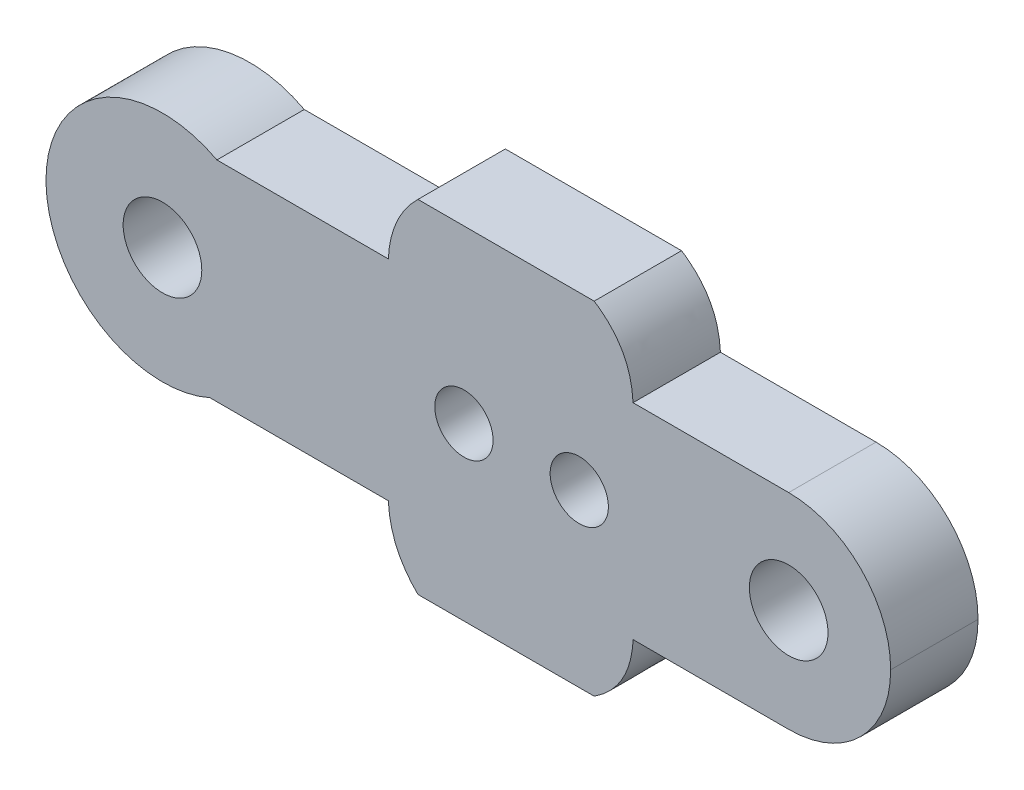
ISO-10303-21;
HEADER;
FILE_DESCRIPTION(('STEP AP214'),'2;1');
FILE_NAME('part.step','',(''),(''),'','','');
FILE_SCHEMA(('AUTOMOTIVE_DESIGN { 1 0 10303 214 1 1 1 1 }'));
ENDSEC;
DATA;
#1=APPLICATION_CONTEXT('core data for automotive mechanical design processes');
#2=APPLICATION_PROTOCOL_DEFINITION('international standard','automotive_design',2000,#1);
#3=PRODUCT_CONTEXT('',#1,'mechanical');
#4=PRODUCT('Part','Part','',(#3));
#5=PRODUCT_RELATED_PRODUCT_CATEGORY('part','',(#4));
#6=PRODUCT_DEFINITION_FORMATION('','',#4);
#7=PRODUCT_DEFINITION_CONTEXT('part definition',#1,'design');
#8=PRODUCT_DEFINITION('design','',#6,#7);
#9=PRODUCT_DEFINITION_SHAPE('','',#8);
#10=(LENGTH_UNIT() NAMED_UNIT(*) SI_UNIT(.MILLI.,.METRE.));
#11=(NAMED_UNIT(*) PLANE_ANGLE_UNIT() SI_UNIT($,.RADIAN.));
#12=(NAMED_UNIT(*) SI_UNIT($,.STERADIAN.) SOLID_ANGLE_UNIT());
#13=UNCERTAINTY_MEASURE_WITH_UNIT(LENGTH_MEASURE(1.E-05),#10,'distance_accuracy_value','');
#14=(GEOMETRIC_REPRESENTATION_CONTEXT(3) GLOBAL_UNCERTAINTY_ASSIGNED_CONTEXT((#13)) GLOBAL_UNIT_ASSIGNED_CONTEXT((#10,
#11,#12)) REPRESENTATION_CONTEXT('',''));
#15=CARTESIAN_POINT('',(0.,0.,0.));
#16=DIRECTION('',(0.,0.,1.));
#17=DIRECTION('',(1.,0.,0.));
#18=AXIS2_PLACEMENT_3D('',#15,#16,#17);
#19=CARTESIAN_POINT('',(21.4999681225819,-0.0214101903655824,3.));
#20=DIRECTION('',(0.,0.,-1.));
#21=DIRECTION('',(-1.,0.,0.));
#22=AXIS2_PLACEMENT_3D('',#19,#20,#21);
#23=PLANE('',#22);
#24=CARTESIAN_POINT('',(21.4999681225819,-0.0214101903655824,3.));
#25=DIRECTION('',(0.,0.,1.));
#26=DIRECTION('',(-1.,0.,0.));
#27=AXIS2_PLACEMENT_3D('',#24,#25,#26);
#28=CIRCLE('',#27,3.50000000000029);
#29=CARTESIAN_POINT('',(21.4999681225822,-3.52141019036587,3.));
#30=VERTEX_POINT('',#29);
#31=CARTESIAN_POINT('',(24.9999026367908,-1.06424607624819E-12,3.));
#32=VERTEX_POINT('',#31);
#33=EDGE_CURVE('E231',#30,#32,#28,.T.);
#34=ORIENTED_EDGE('',*,*,#33,.T.);
#35=CARTESIAN_POINT('',(21.4999681225822,0.0214101903658728,3.));
#36=DIRECTION('',(0.,0.,1.));
#37=DIRECTION('',(1.,0.,0.));
#38=AXIS2_PLACEMENT_3D('',#35,#36,#37);
#39=CIRCLE('',#38,3.5);
#40=CARTESIAN_POINT('',(21.4999681225822,3.52141019036587,3.));
#41=VERTEX_POINT('',#40);
#42=EDGE_CURVE('E109',#32,#41,#39,.T.);
#43=ORIENTED_EDGE('',*,*,#42,.T.);
#44=DIRECTION('',(-1.,0.,0.));
#45=VECTOR('',#44,1.);
#46=CARTESIAN_POINT('',(21.4999681225822,3.52141019036587,3.));
#47=LINE('',#46,#45);
#48=CARTESIAN_POINT('',(16.1562785524943,3.52141019036587,3.));
#49=VERTEX_POINT('',#48);
#50=EDGE_CURVE('E225',#41,#49,#47,.T.);
#51=ORIENTED_EDGE('',*,*,#50,.T.);
#52=CARTESIAN_POINT('',(16.1562785524943,3.52141019036587,3.));
#53=CARTESIAN_POINT('',(16.0881603388808,5.05153717266608,3.));
#54=CARTESIAN_POINT('',(14.8219003344393,5.87390950454192,3.));
#55=B_SPLINE_CURVE_WITH_KNOTS('',2,(#52,#53,#54),.UNSPECIFIED.,.F.,.F.,(3,3),(0.,1.),.UNSPECIFIED.);
#56=CARTESIAN_POINT('',(14.8219003344393,5.87390950454192,3.));
#57=VERTEX_POINT('',#56);
#58=EDGE_CURVE('E220',#49,#57,#55,.T.);
#59=ORIENTED_EDGE('',*,*,#58,.T.);
#60=DIRECTION('',(-1.,0.,0.));
#61=VECTOR('',#60,1.);
#62=CARTESIAN_POINT('',(8.77128221695817,5.87390950454192,3.));
#63=LINE('',#62,#61);
#64=CARTESIAN_POINT('',(8.77128221695817,5.87390950454192,3.));
#65=VERTEX_POINT('',#64);
#66=EDGE_CURVE('E199',#57,#65,#63,.T.);
#67=ORIENTED_EDGE('',*,*,#66,.T.);
#68=CARTESIAN_POINT('',(8.77128221695817,5.87390950454192,3.));
#69=CARTESIAN_POINT('',(7.81640396631,4.94468910288925,3.));
#70=CARTESIAN_POINT('',(7.75477837322135,3.59527965532397,3.));
#71=B_SPLINE_CURVE_WITH_KNOTS('',2,(#68,#69,#70),.UNSPECIFIED.,.F.,.F.,(3,3),(0.,1.),.UNSPECIFIED.);
#72=CARTESIAN_POINT('',(7.75477837322135,3.59527965532397,3.));
#73=VERTEX_POINT('',#72);
#74=EDGE_CURVE('E194',#65,#73,#71,.T.);
#75=ORIENTED_EDGE('',*,*,#74,.T.);
#76=DIRECTION('',(-1.,0.,0.));
#77=VECTOR('',#76,1.);
#78=CARTESIAN_POINT('',(1.86834673217975,3.59527965532397,3.));
#79=LINE('',#78,#77);
#80=CARTESIAN_POINT('',(1.86834673217975,3.59527965532397,3.));
#81=VERTEX_POINT('',#80);
#82=EDGE_CURVE('E192',#73,#81,#79,.T.);
#83=ORIENTED_EDGE('',*,*,#82,.T.);
#84=CARTESIAN_POINT('',(0.,0.0584335336566329,3.));
#85=DIRECTION('',(0.,0.,1.));
#86=DIRECTION('',(1.,0.,0.));
#87=AXIS2_PLACEMENT_3D('',#84,#85,#86);
#88=CIRCLE('',#87,4.);
#89=CARTESIAN_POINT('',(1.62799875081931,-3.59527965532397,3.));
#90=VERTEX_POINT('',#89);
#91=EDGE_CURVE('E190',#81,#90,#88,.T.);
#92=ORIENTED_EDGE('',*,*,#91,.T.);
#93=DIRECTION('',(1.,0.,0.));
#94=VECTOR('',#93,1.);
#95=CARTESIAN_POINT('',(1.62799875081931,-3.59527965532397,3.));
#96=LINE('',#95,#94);
#97=CARTESIAN_POINT('',(7.75477837322134,-3.59527965532397,3.));
#98=VERTEX_POINT('',#97);
#99=EDGE_CURVE('E185',#90,#98,#96,.T.);
#100=ORIENTED_EDGE('',*,*,#99,.T.);
#101=CARTESIAN_POINT('',(7.75477837322134,-3.59527965532397,3.));
#102=CARTESIAN_POINT('',(7.81640396631,-4.94468910288925,3.));
#103=CARTESIAN_POINT('',(8.77128221695817,-5.87390950454192,3.));
#104=B_SPLINE_CURVE_WITH_KNOTS('',2,(#101,#102,#103),.UNSPECIFIED.,.F.,.F.,(3,3),(0.,1.),.UNSPECIFIED.);
#105=CARTESIAN_POINT('',(8.77128221695817,-5.87390950454192,3.));
#106=VERTEX_POINT('',#105);
#107=EDGE_CURVE('E143',#98,#106,#104,.T.);
#108=ORIENTED_EDGE('',*,*,#107,.T.);
#109=DIRECTION('',(1.,0.,0.));
#110=VECTOR('',#109,1.);
#111=CARTESIAN_POINT('',(8.77128221695817,-5.87390950454192,3.));
#112=LINE('',#111,#110);
#113=CARTESIAN_POINT('',(14.8219003344393,-5.87390950454192,3.));
#114=VERTEX_POINT('',#113);
#115=EDGE_CURVE('E137',#106,#114,#112,.T.);
#116=ORIENTED_EDGE('',*,*,#115,.T.);
#117=CARTESIAN_POINT('',(14.8219003344393,-5.87390950454192,3.));
#118=CARTESIAN_POINT('',(16.0881603388808,-5.05153717266608,3.));
#119=CARTESIAN_POINT('',(16.1562785524943,-3.52141019036587,3.));
#120=B_SPLINE_CURVE_WITH_KNOTS('',2,(#117,#118,#119),.UNSPECIFIED.,.F.,.F.,(3,3),(0.,1.),.UNSPECIFIED.);
#121=CARTESIAN_POINT('',(16.1562785524943,-3.52141019036587,3.));
#122=VERTEX_POINT('',#121);
#123=EDGE_CURVE('E141',#114,#122,#120,.T.);
#124=ORIENTED_EDGE('',*,*,#123,.T.);
#125=DIRECTION('',(1.,0.,0.));
#126=VECTOR('',#125,1.);
#127=CARTESIAN_POINT('',(21.4999681225822,-3.52141019036587,3.));
#128=LINE('',#127,#126);
#129=EDGE_CURVE('E51',#122,#30,#128,.T.);
#130=ORIENTED_EDGE('',*,*,#129,.T.);
#131=EDGE_LOOP('',(#34,#43,#51,#59,#67,#75,#83,#92,#100,#108,#116,#124,#130));
#132=FACE_BOUND('',#131,.T.);
#133=CARTESIAN_POINT('',(0.,0.0584335336566329,3.));
#134=DIRECTION('',(0.,0.,1.));
#135=DIRECTION('',(1.,0.,0.));
#136=AXIS2_PLACEMENT_3D('',#133,#134,#135);
#137=CIRCLE('',#136,1.35);
#138=CARTESIAN_POINT('',(1.35,0.0584335336566329,3.));
#139=VERTEX_POINT('',#138);
#140=EDGE_CURVE('E236',#139,#139,#137,.T.);
#141=ORIENTED_EDGE('',*,*,#140,.F.);
#142=EDGE_LOOP('',(#141));
#143=FACE_BOUND('',#142,.T.);
#144=CARTESIAN_POINT('',(10.35,0.,3.));
#145=DIRECTION('',(0.,0.,1.));
#146=DIRECTION('',(1.,0.,0.));
#147=AXIS2_PLACEMENT_3D('',#144,#145,#146);
#148=CIRCLE('',#147,1.);
#149=CARTESIAN_POINT('',(11.35,0.,3.));
#150=VERTEX_POINT('',#149);
#151=EDGE_CURVE('E237',#150,#150,#148,.T.);
#152=ORIENTED_EDGE('',*,*,#151,.F.);
#153=EDGE_LOOP('',(#152));
#154=FACE_BOUND('',#153,.T.);
#155=CARTESIAN_POINT('',(14.31,0.,3.));
#156=DIRECTION('',(0.,0.,1.));
#157=DIRECTION('',(1.,0.,0.));
#158=AXIS2_PLACEMENT_3D('',#155,#156,#157);
#159=CIRCLE('',#158,1.);
#160=CARTESIAN_POINT('',(15.31,0.,3.));
#161=VERTEX_POINT('',#160);
#162=EDGE_CURVE('E244',#161,#161,#159,.T.);
#163=ORIENTED_EDGE('',*,*,#162,.F.);
#164=EDGE_LOOP('',(#163));
#165=FACE_BOUND('',#164,.T.);
#166=CARTESIAN_POINT('',(21.4999681225822,0.0214101903658728,3.));
#167=DIRECTION('',(0.,0.,1.));
#168=DIRECTION('',(1.,0.,0.));
#169=AXIS2_PLACEMENT_3D('',#166,#167,#168);
#170=CIRCLE('',#169,1.35);
#171=CARTESIAN_POINT('',(22.8499681225822,0.0214101903658728,3.));
#172=VERTEX_POINT('',#171);
#173=EDGE_CURVE('E250',#172,#172,#170,.T.);
#174=ORIENTED_EDGE('',*,*,#173,.F.);
#175=EDGE_LOOP('',(#174));
#176=FACE_BOUND('',#175,.T.);
#177=ADVANCED_FACE('F34',(#132,#143,#154,#165,#176),#23,.F.);
#178=CARTESIAN_POINT('',(21.4999681225819,-0.0214101903655824,0.));
#179=DIRECTION('',(0.,0.,-1.));
#180=DIRECTION('',(-1.,0.,0.));
#181=AXIS2_PLACEMENT_3D('',#178,#179,#180);
#182=PLANE('',#181);
#183=CARTESIAN_POINT('',(14.31,0.,0.));
#184=DIRECTION('',(0.,0.,1.));
#185=DIRECTION('',(1.,0.,0.));
#186=AXIS2_PLACEMENT_3D('',#183,#184,#185);
#187=CIRCLE('',#186,1.);
#188=CARTESIAN_POINT('',(15.31,0.,0.));
#189=VERTEX_POINT('',#188);
#190=EDGE_CURVE('E247',#189,#189,#187,.T.);
#191=ORIENTED_EDGE('',*,*,#190,.T.);
#192=EDGE_LOOP('',(#191));
#193=FACE_BOUND('',#192,.T.);
#194=CARTESIAN_POINT('',(0.,0.0584335336566329,0.));
#195=DIRECTION('',(0.,0.,1.));
#196=DIRECTION('',(1.,0.,0.));
#197=AXIS2_PLACEMENT_3D('',#194,#195,#196);
#198=CIRCLE('',#197,1.35);
#199=CARTESIAN_POINT('',(1.35,0.0584335336566329,0.));
#200=VERTEX_POINT('',#199);
#201=EDGE_CURVE('E233',#200,#200,#198,.T.);
#202=ORIENTED_EDGE('',*,*,#201,.T.);
#203=EDGE_LOOP('',(#202));
#204=FACE_BOUND('',#203,.T.);
#205=CARTESIAN_POINT('',(21.4999681225819,-0.0214101903655824,0.));
#206=DIRECTION('',(0.,0.,1.));
#207=DIRECTION('',(-1.,0.,0.));
#208=AXIS2_PLACEMENT_3D('',#205,#206,#207);
#209=CIRCLE('',#208,3.50000000000029);
#210=CARTESIAN_POINT('',(21.4999681225822,-3.52141019036587,0.));
#211=VERTEX_POINT('',#210);
#212=CARTESIAN_POINT('',(24.9999026367908,-1.06424607624819E-12,0.));
#213=VERTEX_POINT('',#212);
#214=EDGE_CURVE('E240',#211,#213,#209,.T.);
#215=ORIENTED_EDGE('',*,*,#214,.F.);
#216=DIRECTION('',(1.,0.,0.));
#217=VECTOR('',#216,1.);
#218=CARTESIAN_POINT('',(21.4999681225822,-3.52141019036587,0.));
#219=LINE('',#218,#217);
#220=CARTESIAN_POINT('',(16.1562785524943,-3.52141019036587,0.));
#221=VERTEX_POINT('',#220);
#222=EDGE_CURVE('E101',#221,#211,#219,.T.);
#223=ORIENTED_EDGE('',*,*,#222,.F.);
#224=CARTESIAN_POINT('',(14.8219003344393,-5.87390950454192,0.));
#225=CARTESIAN_POINT('',(16.0881603388808,-5.05153717266608,0.));
#226=CARTESIAN_POINT('',(16.1562785524943,-3.52141019036587,0.));
#227=B_SPLINE_CURVE_WITH_KNOTS('',2,(#224,#225,#226),.UNSPECIFIED.,.F.,.F.,(3,3),(0.,1.),.UNSPECIFIED.);
#228=CARTESIAN_POINT('',(14.8219003344393,-5.87390950454192,0.));
#229=VERTEX_POINT('',#228);
#230=EDGE_CURVE('E95',#229,#221,#227,.T.);
#231=ORIENTED_EDGE('',*,*,#230,.F.);
#232=DIRECTION('',(1.,0.,0.));
#233=VECTOR('',#232,1.);
#234=CARTESIAN_POINT('',(8.77128221695817,-5.87390950454192,0.));
#235=LINE('',#234,#233);
#236=CARTESIAN_POINT('',(8.77128221695817,-5.87390950454192,0.));
#237=VERTEX_POINT('',#236);
#238=EDGE_CURVE('E151',#237,#229,#235,.T.);
#239=ORIENTED_EDGE('',*,*,#238,.F.);
#240=CARTESIAN_POINT('',(7.75477837322134,-3.59527965532397,0.));
#241=CARTESIAN_POINT('',(7.81640396631,-4.94468910288925,0.));
#242=CARTESIAN_POINT('',(8.77128221695817,-5.87390950454192,0.));
#243=B_SPLINE_CURVE_WITH_KNOTS('',2,(#240,#241,#242),.UNSPECIFIED.,.F.,.F.,(3,3),(0.,1.),.UNSPECIFIED.);
#244=CARTESIAN_POINT('',(7.75477837322134,-3.59527965532397,0.));
#245=VERTEX_POINT('',#244);
#246=EDGE_CURVE('E441',#245,#237,#243,.T.);
#247=ORIENTED_EDGE('',*,*,#246,.F.);
#248=DIRECTION('',(1.,0.,0.));
#249=VECTOR('',#248,1.);
#250=CARTESIAN_POINT('',(1.62799875081931,-3.59527965532397,0.));
#251=LINE('',#250,#249);
#252=CARTESIAN_POINT('',(1.62799875081931,-3.59527965532397,0.));
#253=VERTEX_POINT('',#252);
#254=EDGE_CURVE('E439',#253,#245,#251,.T.);
#255=ORIENTED_EDGE('',*,*,#254,.F.);
#256=CARTESIAN_POINT('',(0.,0.0584335336566329,0.));
#257=DIRECTION('',(0.,0.,1.));
#258=DIRECTION('',(1.,0.,0.));
#259=AXIS2_PLACEMENT_3D('',#256,#257,#258);
#260=CIRCLE('',#259,4.);
#261=CARTESIAN_POINT('',(1.86834673217975,3.59527965532397,0.));
#262=VERTEX_POINT('',#261);
#263=EDGE_CURVE('E437',#262,#253,#260,.T.);
#264=ORIENTED_EDGE('',*,*,#263,.F.);
#265=DIRECTION('',(-1.,0.,0.));
#266=VECTOR('',#265,1.);
#267=CARTESIAN_POINT('',(1.86834673217975,3.59527965532397,0.));
#268=LINE('',#267,#266);
#269=CARTESIAN_POINT('',(7.75477837322135,3.59527965532397,0.));
#270=VERTEX_POINT('',#269);
#271=EDGE_CURVE('E432',#270,#262,#268,.T.);
#272=ORIENTED_EDGE('',*,*,#271,.F.);
#273=CARTESIAN_POINT('',(8.77128221695817,5.87390950454192,0.));
#274=CARTESIAN_POINT('',(7.81640396631,4.94468910288925,0.));
#275=CARTESIAN_POINT('',(7.75477837322135,3.59527965532397,0.));
#276=B_SPLINE_CURVE_WITH_KNOTS('',2,(#273,#274,#275),.UNSPECIFIED.,.F.,.F.,(3,3),(0.,1.),.UNSPECIFIED.);
#277=CARTESIAN_POINT('',(8.77128221695817,5.87390950454192,0.));
#278=VERTEX_POINT('',#277);
#279=EDGE_CURVE('E428',#278,#270,#276,.T.);
#280=ORIENTED_EDGE('',*,*,#279,.F.);
#281=DIRECTION('',(-1.,0.,0.));
#282=VECTOR('',#281,1.);
#283=CARTESIAN_POINT('',(8.77128221695817,5.87390950454192,0.));
#284=LINE('',#283,#282);
#285=CARTESIAN_POINT('',(14.8219003344393,5.87390950454192,0.));
#286=VERTEX_POINT('',#285);
#287=EDGE_CURVE('E423',#286,#278,#284,.T.);
#288=ORIENTED_EDGE('',*,*,#287,.F.);
#289=CARTESIAN_POINT('',(16.1562785524943,3.52141019036587,0.));
#290=CARTESIAN_POINT('',(16.0881603388808,5.05153717266608,0.));
#291=CARTESIAN_POINT('',(14.8219003344393,5.87390950454192,0.));
#292=B_SPLINE_CURVE_WITH_KNOTS('',2,(#289,#290,#291),.UNSPECIFIED.,.F.,.F.,(3,3),(0.,1.),.UNSPECIFIED.);
#293=CARTESIAN_POINT('',(16.1562785524943,3.52141019036587,0.));
#294=VERTEX_POINT('',#293);
#295=EDGE_CURVE('E419',#294,#286,#292,.T.);
#296=ORIENTED_EDGE('',*,*,#295,.F.);
#297=DIRECTION('',(-1.,0.,0.));
#298=VECTOR('',#297,1.);
#299=CARTESIAN_POINT('',(21.4999681225822,3.52141019036587,0.));
#300=LINE('',#299,#298);
#301=CARTESIAN_POINT('',(21.4999681225822,3.52141019036587,0.));
#302=VERTEX_POINT('',#301);
#303=EDGE_CURVE('E415',#302,#294,#300,.T.);
#304=ORIENTED_EDGE('',*,*,#303,.F.);
#305=CARTESIAN_POINT('',(21.4999681225822,0.0214101903658728,0.));
#306=DIRECTION('',(0.,0.,1.));
#307=DIRECTION('',(1.,0.,0.));
#308=AXIS2_PLACEMENT_3D('',#305,#306,#307);
#309=CIRCLE('',#308,3.5);
#310=EDGE_CURVE('E414',#213,#302,#309,.T.);
#311=ORIENTED_EDGE('',*,*,#310,.F.);
#312=EDGE_LOOP('',(#215,#223,#231,#239,#247,#255,#264,#272,#280,#288,#296,#304,#311));
#313=FACE_BOUND('',#312,.T.);
#314=CARTESIAN_POINT('',(10.35,0.,0.));
#315=DIRECTION('',(0.,0.,1.));
#316=DIRECTION('',(1.,0.,0.));
#317=AXIS2_PLACEMENT_3D('',#314,#315,#316);
#318=CIRCLE('',#317,1.);
#319=CARTESIAN_POINT('',(11.35,0.,0.));
#320=VERTEX_POINT('',#319);
#321=EDGE_CURVE('E241',#320,#320,#318,.T.);
#322=ORIENTED_EDGE('',*,*,#321,.T.);
#323=EDGE_LOOP('',(#322));
#324=FACE_BOUND('',#323,.T.);
#325=CARTESIAN_POINT('',(21.4999681225822,0.0214101903658728,0.));
#326=DIRECTION('',(0.,0.,1.));
#327=DIRECTION('',(1.,0.,0.));
#328=AXIS2_PLACEMENT_3D('',#325,#326,#327);
#329=CIRCLE('',#328,1.35);
#330=CARTESIAN_POINT('',(22.8499681225822,0.0214101903658728,0.));
#331=VERTEX_POINT('',#330);
#332=EDGE_CURVE('E253',#331,#331,#329,.T.);
#333=ORIENTED_EDGE('',*,*,#332,.T.);
#334=EDGE_LOOP('',(#333));
#335=FACE_BOUND('',#334,.T.);
#336=ADVANCED_FACE('F263',(#193,#204,#313,#324,#335),#182,.T.);
#337=CARTESIAN_POINT('',(21.4999681225819,-0.0214101903655824,3.));
#338=DIRECTION('',(0.,0.,-1.));
#339=DIRECTION('',(-1.,0.,0.));
#340=AXIS2_PLACEMENT_3D('',#337,#338,#339);
#341=CYLINDRICAL_SURFACE('',#340,3.50000000000029);
#342=ORIENTED_EDGE('',*,*,#214,.T.);
#343=DIRECTION('',(0.,0.,-1.));
#344=VECTOR('',#343,1.);
#345=CARTESIAN_POINT('',(24.9999026367908,-1.06424607624819E-12,3.));
#346=LINE('',#345,#344);
#347=EDGE_CURVE('E11',#32,#213,#346,.T.);
#348=ORIENTED_EDGE('',*,*,#347,.F.);
#349=ORIENTED_EDGE('',*,*,#33,.F.);
#350=DIRECTION('',(0.,0.,-1.));
#351=VECTOR('',#350,1.);
#352=CARTESIAN_POINT('',(21.4999681225822,-3.52141019036587,3.));
#353=LINE('',#352,#351);
#354=EDGE_CURVE('E157',#30,#211,#353,.T.);
#355=ORIENTED_EDGE('',*,*,#354,.T.);
#356=EDGE_LOOP('',(#342,#348,#349,#355));
#357=FACE_BOUND('',#356,.T.);
#358=ADVANCED_FACE('F36',(#357),#341,.T.);
#359=CARTESIAN_POINT('',(21.4999681225822,0.0214101903658728,3.));
#360=DIRECTION('',(0.,0.,-1.));
#361=DIRECTION('',(-1.,0.,0.));
#362=AXIS2_PLACEMENT_3D('',#359,#360,#361);
#363=CYLINDRICAL_SURFACE('',#362,3.5);
#364=ORIENTED_EDGE('',*,*,#310,.T.);
#365=DIRECTION('',(0.,0.,-1.));
#366=VECTOR('',#365,1.);
#367=CARTESIAN_POINT('',(21.4999681225822,3.52141019036587,3.));
#368=LINE('',#367,#366);
#369=EDGE_CURVE('E43',#41,#302,#368,.T.);
#370=ORIENTED_EDGE('',*,*,#369,.F.);
#371=ORIENTED_EDGE('',*,*,#42,.F.);
#372=ORIENTED_EDGE('',*,*,#347,.T.);
#373=EDGE_LOOP('',(#364,#370,#371,#372));
#374=FACE_BOUND('',#373,.T.);
#375=ADVANCED_FACE('F351',(#374),#363,.T.);
#376=CARTESIAN_POINT('',(21.4999681225822,3.52141019036587,3.));
#377=DIRECTION('',(0.,-1.,0.));
#378=DIRECTION('',(0.,0.,-1.));
#379=AXIS2_PLACEMENT_3D('',#376,#377,#378);
#380=PLANE('',#379);
#381=ORIENTED_EDGE('',*,*,#303,.T.);
#382=DIRECTION('',(0.,0.,-1.));
#383=VECTOR('',#382,1.);
#384=CARTESIAN_POINT('',(16.1562785524943,3.52141019036587,3.));
#385=LINE('',#384,#383);
#386=EDGE_CURVE('E477',#49,#294,#385,.T.);
#387=ORIENTED_EDGE('',*,*,#386,.F.);
#388=ORIENTED_EDGE('',*,*,#50,.F.);
#389=ORIENTED_EDGE('',*,*,#369,.T.);
#390=EDGE_LOOP('',(#381,#387,#388,#389));
#391=FACE_BOUND('',#390,.T.);
#392=ADVANCED_FACE('F218',(#391),#380,.F.);
#393=DIRECTION('',(0.,0.,-1.));
#394=VECTOR('',#393,1.);
#395=SURFACE_OF_LINEAR_EXTRUSION('',#55,#394);
#396=ORIENTED_EDGE('',*,*,#295,.T.);
#397=DIRECTION('',(0.,0.,-1.));
#398=VECTOR('',#397,1.);
#399=CARTESIAN_POINT('',(14.8219003344393,5.87390950454192,3.));
#400=LINE('',#399,#398);
#401=EDGE_CURVE('E474',#57,#286,#400,.T.);
#402=ORIENTED_EDGE('',*,*,#401,.F.);
#403=ORIENTED_EDGE('',*,*,#58,.F.);
#404=ORIENTED_EDGE('',*,*,#386,.T.);
#405=EDGE_LOOP('',(#396,#402,#403,#404));
#406=FACE_BOUND('',#405,.T.);
#407=ADVANCED_FACE('F214',(#406),#395,.F.);
#408=CARTESIAN_POINT('',(8.77128221695817,5.87390950454192,3.));
#409=DIRECTION('',(0.,-1.,0.));
#410=DIRECTION('',(0.,0.,-1.));
#411=AXIS2_PLACEMENT_3D('',#408,#409,#410);
#412=PLANE('',#411);
#413=ORIENTED_EDGE('',*,*,#287,.T.);
#414=DIRECTION('',(0.,0.,-1.));
#415=VECTOR('',#414,1.);
#416=CARTESIAN_POINT('',(8.77128221695817,5.87390950454192,3.));
#417=LINE('',#416,#415);
#418=EDGE_CURVE('E471',#65,#278,#417,.T.);
#419=ORIENTED_EDGE('',*,*,#418,.F.);
#420=ORIENTED_EDGE('',*,*,#66,.F.);
#421=ORIENTED_EDGE('',*,*,#401,.T.);
#422=EDGE_LOOP('',(#413,#419,#420,#421));
#423=FACE_BOUND('',#422,.T.);
#424=ADVANCED_FACE('F210',(#423),#412,.F.);
#425=DIRECTION('',(0.,0.,-1.));
#426=VECTOR('',#425,1.);
#427=SURFACE_OF_LINEAR_EXTRUSION('',#71,#426);
#428=ORIENTED_EDGE('',*,*,#279,.T.);
#429=DIRECTION('',(0.,0.,-1.));
#430=VECTOR('',#429,1.);
#431=CARTESIAN_POINT('',(7.75477837322135,3.59527965532397,3.));
#432=LINE('',#431,#430);
#433=EDGE_CURVE('E468',#73,#270,#432,.T.);
#434=ORIENTED_EDGE('',*,*,#433,.F.);
#435=ORIENTED_EDGE('',*,*,#74,.F.);
#436=ORIENTED_EDGE('',*,*,#418,.T.);
#437=EDGE_LOOP('',(#428,#434,#435,#436));
#438=FACE_BOUND('',#437,.T.);
#439=ADVANCED_FACE('F205',(#438),#427,.F.);
#440=CARTESIAN_POINT('',(1.86834673217975,3.59527965532397,3.));
#441=DIRECTION('',(0.,-1.,0.));
#442=DIRECTION('',(0.,0.,-1.));
#443=AXIS2_PLACEMENT_3D('',#440,#441,#442);
#444=PLANE('',#443);
#445=ORIENTED_EDGE('',*,*,#271,.T.);
#446=DIRECTION('',(0.,0.,-1.));
#447=VECTOR('',#446,1.);
#448=CARTESIAN_POINT('',(1.86834673217975,3.59527965532397,3.));
#449=LINE('',#448,#447);
#450=EDGE_CURVE('E465',#81,#262,#449,.T.);
#451=ORIENTED_EDGE('',*,*,#450,.F.);
#452=ORIENTED_EDGE('',*,*,#82,.F.);
#453=ORIENTED_EDGE('',*,*,#433,.T.);
#454=EDGE_LOOP('',(#445,#451,#452,#453));
#455=FACE_BOUND('',#454,.T.);
#456=ADVANCED_FACE('F209',(#455),#444,.F.);
#457=CARTESIAN_POINT('',(0.,0.0584335336566329,3.));
#458=DIRECTION('',(0.,0.,-1.));
#459=DIRECTION('',(-1.,0.,0.));
#460=AXIS2_PLACEMENT_3D('',#457,#458,#459);
#461=CYLINDRICAL_SURFACE('',#460,4.);
#462=ORIENTED_EDGE('',*,*,#263,.T.);
#463=DIRECTION('',(0.,0.,-1.));
#464=VECTOR('',#463,1.);
#465=CARTESIAN_POINT('',(1.62799875081931,-3.59527965532397,3.));
#466=LINE('',#465,#464);
#467=EDGE_CURVE('E462',#90,#253,#466,.T.);
#468=ORIENTED_EDGE('',*,*,#467,.F.);
#469=ORIENTED_EDGE('',*,*,#91,.F.);
#470=ORIENTED_EDGE('',*,*,#450,.T.);
#471=EDGE_LOOP('',(#462,#468,#469,#470));
#472=FACE_BOUND('',#471,.T.);
#473=ADVANCED_FACE('F320',(#472),#461,.T.);
#474=CARTESIAN_POINT('',(1.62799875081931,-3.59527965532397,3.));
#475=DIRECTION('',(0.,1.,0.));
#476=DIRECTION('',(0.,0.,1.));
#477=AXIS2_PLACEMENT_3D('',#474,#475,#476);
#478=PLANE('',#477);
#479=ORIENTED_EDGE('',*,*,#254,.T.);
#480=DIRECTION('',(0.,0.,-1.));
#481=VECTOR('',#480,1.);
#482=CARTESIAN_POINT('',(7.75477837322134,-3.59527965532397,3.));
#483=LINE('',#482,#481);
#484=EDGE_CURVE('E459',#98,#245,#483,.T.);
#485=ORIENTED_EDGE('',*,*,#484,.F.);
#486=ORIENTED_EDGE('',*,*,#99,.F.);
#487=ORIENTED_EDGE('',*,*,#467,.T.);
#488=EDGE_LOOP('',(#479,#485,#486,#487));
#489=FACE_BOUND('',#488,.T.);
#490=ADVANCED_FACE('F178',(#489),#478,.F.);
#491=DIRECTION('',(0.,0.,-1.));
#492=VECTOR('',#491,1.);
#493=SURFACE_OF_LINEAR_EXTRUSION('',#104,#492);
#494=ORIENTED_EDGE('',*,*,#246,.T.);
#495=DIRECTION('',(0.,0.,-1.));
#496=VECTOR('',#495,1.);
#497=CARTESIAN_POINT('',(8.77128221695817,-5.87390950454192,3.));
#498=LINE('',#497,#496);
#499=EDGE_CURVE('E152',#106,#237,#498,.T.);
#500=ORIENTED_EDGE('',*,*,#499,.F.);
#501=ORIENTED_EDGE('',*,*,#107,.F.);
#502=ORIENTED_EDGE('',*,*,#484,.T.);
#503=EDGE_LOOP('',(#494,#500,#501,#502));
#504=FACE_BOUND('',#503,.T.);
#505=ADVANCED_FACE('F175',(#504),#493,.F.);
#506=CARTESIAN_POINT('',(8.77128221695817,-5.87390950454192,3.));
#507=DIRECTION('',(0.,1.,0.));
#508=DIRECTION('',(0.,0.,1.));
#509=AXIS2_PLACEMENT_3D('',#506,#507,#508);
#510=PLANE('',#509);
#511=ORIENTED_EDGE('',*,*,#238,.T.);
#512=DIRECTION('',(0.,0.,-1.));
#513=VECTOR('',#512,1.);
#514=CARTESIAN_POINT('',(14.8219003344393,-5.87390950454192,3.));
#515=LINE('',#514,#513);
#516=EDGE_CURVE('E148',#114,#229,#515,.T.);
#517=ORIENTED_EDGE('',*,*,#516,.F.);
#518=ORIENTED_EDGE('',*,*,#115,.F.);
#519=ORIENTED_EDGE('',*,*,#499,.T.);
#520=EDGE_LOOP('',(#511,#517,#518,#519));
#521=FACE_BOUND('',#520,.T.);
#522=ADVANCED_FACE('F149',(#521),#510,.F.);
#523=DIRECTION('',(0.,0.,-1.));
#524=VECTOR('',#523,1.);
#525=SURFACE_OF_LINEAR_EXTRUSION('',#120,#524);
#526=ORIENTED_EDGE('',*,*,#230,.T.);
#527=DIRECTION('',(0.,0.,-1.));
#528=VECTOR('',#527,1.);
#529=CARTESIAN_POINT('',(16.1562785524943,-3.52141019036587,3.));
#530=LINE('',#529,#528);
#531=EDGE_CURVE('E153',#122,#221,#530,.T.);
#532=ORIENTED_EDGE('',*,*,#531,.F.);
#533=ORIENTED_EDGE('',*,*,#123,.F.);
#534=ORIENTED_EDGE('',*,*,#516,.T.);
#535=EDGE_LOOP('',(#526,#532,#533,#534));
#536=FACE_BOUND('',#535,.T.);
#537=ADVANCED_FACE('F155',(#536),#525,.F.);
#538=CARTESIAN_POINT('',(21.4999681225822,-3.52141019036587,3.));
#539=DIRECTION('',(0.,1.,0.));
#540=DIRECTION('',(0.,0.,1.));
#541=AXIS2_PLACEMENT_3D('',#538,#539,#540);
#542=PLANE('',#541);
#543=ORIENTED_EDGE('',*,*,#222,.T.);
#544=ORIENTED_EDGE('',*,*,#354,.F.);
#545=ORIENTED_EDGE('',*,*,#129,.F.);
#546=ORIENTED_EDGE('',*,*,#531,.T.);
#547=EDGE_LOOP('',(#543,#544,#545,#546));
#548=FACE_BOUND('',#547,.T.);
#549=ADVANCED_FACE('F171',(#548),#542,.F.);
#550=CARTESIAN_POINT('',(0.,0.0584335336566329,3.));
#551=DIRECTION('',(0.,0.,-1.));
#552=DIRECTION('',(-1.,0.,0.));
#553=AXIS2_PLACEMENT_3D('',#550,#551,#552);
#554=CYLINDRICAL_SURFACE('',#553,1.35);
#555=ORIENTED_EDGE('',*,*,#140,.T.);
#556=EDGE_LOOP('',(#555));
#557=FACE_BOUND('',#556,.T.);
#558=ORIENTED_EDGE('',*,*,#201,.F.);
#559=EDGE_LOOP('',(#558));
#560=FACE_BOUND('',#559,.T.);
#561=ADVANCED_FACE('F270',(#557,#560),#554,.F.);
#562=CARTESIAN_POINT('',(10.35,0.,3.));
#563=DIRECTION('',(0.,0.,-1.));
#564=DIRECTION('',(-1.,0.,0.));
#565=AXIS2_PLACEMENT_3D('',#562,#563,#564);
#566=CYLINDRICAL_SURFACE('',#565,1.);
#567=ORIENTED_EDGE('',*,*,#151,.T.);
#568=EDGE_LOOP('',(#567));
#569=FACE_BOUND('',#568,.T.);
#570=ORIENTED_EDGE('',*,*,#321,.F.);
#571=EDGE_LOOP('',(#570));
#572=FACE_BOUND('',#571,.T.);
#573=ADVANCED_FACE('F273',(#569,#572),#566,.F.);
#574=CARTESIAN_POINT('',(14.31,0.,3.));
#575=DIRECTION('',(0.,0.,-1.));
#576=DIRECTION('',(-1.,0.,0.));
#577=AXIS2_PLACEMENT_3D('',#574,#575,#576);
#578=CYLINDRICAL_SURFACE('',#577,1.);
#579=ORIENTED_EDGE('',*,*,#162,.T.);
#580=EDGE_LOOP('',(#579));
#581=FACE_BOUND('',#580,.T.);
#582=ORIENTED_EDGE('',*,*,#190,.F.);
#583=EDGE_LOOP('',(#582));
#584=FACE_BOUND('',#583,.T.);
#585=ADVANCED_FACE('F277',(#581,#584),#578,.F.);
#586=CARTESIAN_POINT('',(21.4999681225822,0.0214101903658728,3.));
#587=DIRECTION('',(0.,0.,-1.));
#588=DIRECTION('',(-1.,0.,0.));
#589=AXIS2_PLACEMENT_3D('',#586,#587,#588);
#590=CYLINDRICAL_SURFACE('',#589,1.35);
#591=ORIENTED_EDGE('',*,*,#173,.T.);
#592=EDGE_LOOP('',(#591));
#593=FACE_BOUND('',#592,.T.);
#594=ORIENTED_EDGE('',*,*,#332,.F.);
#595=EDGE_LOOP('',(#594));
#596=FACE_BOUND('',#595,.T.);
#597=ADVANCED_FACE('F259',(#593,#596),#590,.F.);
#598=CLOSED_SHELL('',(#177,#336,#358,#375,#392,#407,#424,#439,#456,#473,#490,#505,#522,#537,
#549,#561,#573,#585,#597));
#599=MANIFOLD_SOLID_BREP('B2',#598);
#600=ADVANCED_BREP_SHAPE_REPRESENTATION('',(#18,#599),#14);
#601=SHAPE_DEFINITION_REPRESENTATION(#9,#600);
ENDSEC;
END-ISO-10303-21;
